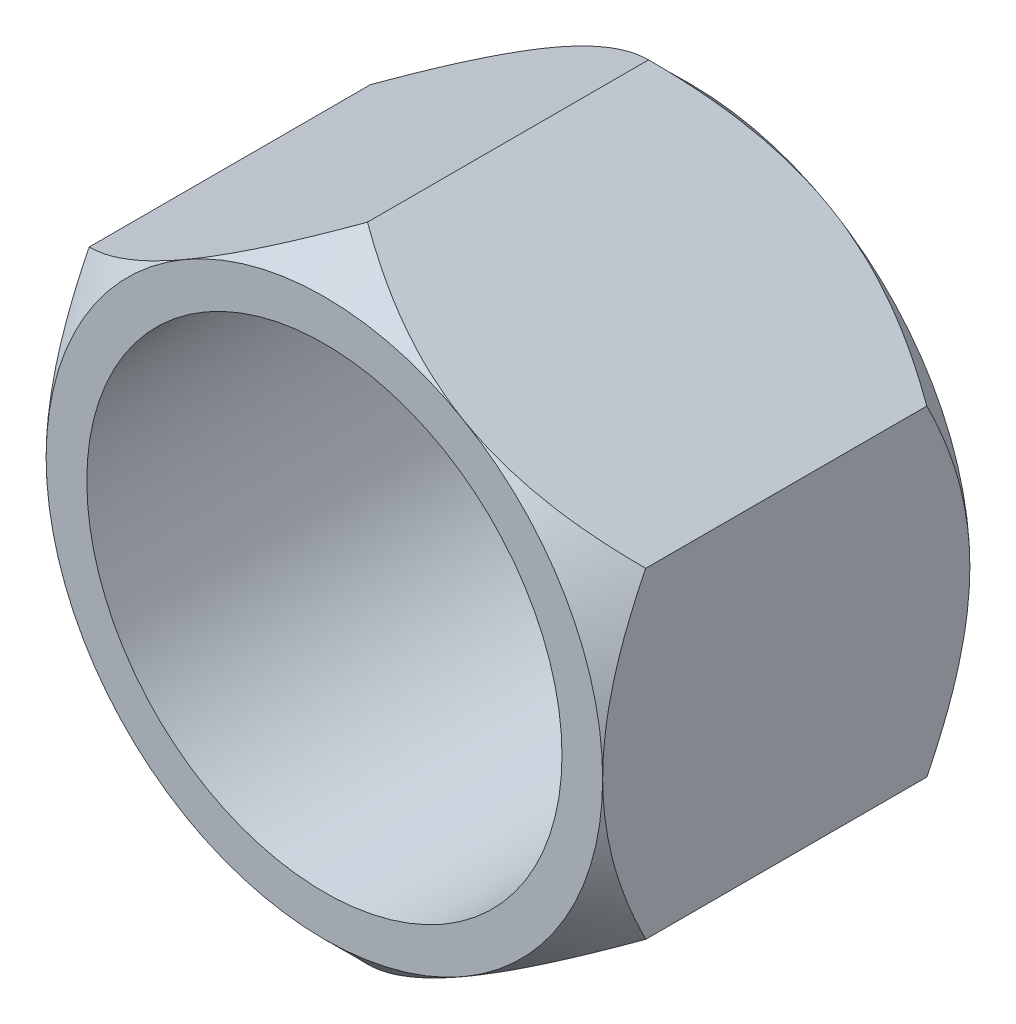
ISO-10303-21;
HEADER;
FILE_DESCRIPTION(('STEP AP214'),'2;1');
FILE_NAME('part.step','',(''),(''),'','','');
FILE_SCHEMA(('AUTOMOTIVE_DESIGN { 1 0 10303 214 1 1 1 1 }'));
ENDSEC;
DATA;
#1=APPLICATION_CONTEXT('core data for automotive mechanical design processes');
#2=APPLICATION_PROTOCOL_DEFINITION('international standard','automotive_design',2000,#1);
#3=PRODUCT_CONTEXT('',#1,'mechanical');
#4=PRODUCT('Part','Part','',(#3));
#5=PRODUCT_RELATED_PRODUCT_CATEGORY('part','',(#4));
#6=PRODUCT_DEFINITION_FORMATION('','',#4);
#7=PRODUCT_DEFINITION_CONTEXT('part definition',#1,'design');
#8=PRODUCT_DEFINITION('design','',#6,#7);
#9=PRODUCT_DEFINITION_SHAPE('','',#8);
#10=(LENGTH_UNIT() NAMED_UNIT(*) SI_UNIT(.MILLI.,.METRE.));
#11=(NAMED_UNIT(*) PLANE_ANGLE_UNIT() SI_UNIT($,.RADIAN.));
#12=(NAMED_UNIT(*) SI_UNIT($,.STERADIAN.) SOLID_ANGLE_UNIT());
#13=UNCERTAINTY_MEASURE_WITH_UNIT(LENGTH_MEASURE(1.E-05),#10,'distance_accuracy_value','');
#14=(GEOMETRIC_REPRESENTATION_CONTEXT(3) GLOBAL_UNCERTAINTY_ASSIGNED_CONTEXT((#13)) GLOBAL_UNIT_ASSIGNED_CONTEXT((#10,
#11,#12)) REPRESENTATION_CONTEXT('',''));
#15=CARTESIAN_POINT('',(0.,0.,0.));
#16=DIRECTION('',(0.,0.,1.));
#17=DIRECTION('',(1.,0.,0.));
#18=AXIS2_PLACEMENT_3D('',#15,#16,#17);
#19=CARTESIAN_POINT('',(0.151554445662277,-0.0875,0.2));
#20=DIRECTION('',(-1.,0.,0.));
#21=DIRECTION('',(0.,-1.,0.));
#22=AXIS2_PLACEMENT_3D('',#19,#20,#21);
#23=PLANE('',#22);
#24=CARTESIAN_POINT('',(0.151554445662277,0.265252809045647,0.153941548921296));
#25=CARTESIAN_POINT('',(0.151554445662277,0.257413577521273,0.147136723057462));
#26=CARTESIAN_POINT('',(0.151554445662277,0.24953890268298,0.140371685194706));
#27=CARTESIAN_POINT('',(0.151554445662277,0.233693360178287,0.126947700726018));
#28=CARTESIAN_POINT('',(0.151554445662277,0.225722448845134,0.120288805725225));
#29=CARTESIAN_POINT('',(0.151554445662277,0.20127757927172,0.100224502949948));
#30=CARTESIAN_POINT('',(0.151554445662277,0.184622038181727,0.0870403761324174));
#31=CARTESIAN_POINT('',(0.151554445662277,0.150473327964701,0.0616957198227952));
#32=CARTESIAN_POINT('',(0.151554445662277,0.132979032551724,0.0495366307855175));
#33=CARTESIAN_POINT('',(0.151554445662277,0.105718301421107,0.0330932832712818));
#34=CARTESIAN_POINT('',(0.151554445662277,0.0964952228144128,0.0279262235469108));
#35=CARTESIAN_POINT('',(0.151554445662277,0.0775984991883152,0.0185126288870026));
#36=CARTESIAN_POINT('',(0.151554445662277,0.0679257178102974,0.0142644114034934));
#37=CARTESIAN_POINT('',(0.151554445662277,0.0478316038796866,0.00708739186175746));
#38=CARTESIAN_POINT('',(0.151554445662277,0.037398452796036,0.00418982297345107));
#39=CARTESIAN_POINT('',(0.151554445662277,0.0162087911267058,0.000514071164123184));
#40=CARTESIAN_POINT('',(0.151554445662277,0.00545499835341562,-0.000278552646487929));
#41=CARTESIAN_POINT('',(0.151554445662277,-0.0159837687082633,0.000461357663632967));
#42=CARTESIAN_POINT('',(0.151554445662277,-0.0266685911855761,0.00199792918940043));
#43=CARTESIAN_POINT('',(0.151554445662277,-0.0476361544442964,0.0069767725204824));
#44=CARTESIAN_POINT('',(0.151554445662277,-0.0579151064681395,0.0104338234269583));
#45=CARTESIAN_POINT('',(0.151554445662277,-0.0801193372832188,0.0195101444980973));
#46=CARTESIAN_POINT('',(0.151554445662277,-0.0919131136327771,0.0254369229488123));
#47=CARTESIAN_POINT('',(0.151554445662277,-0.114891112264997,0.0383914997639153));
#48=CARTESIAN_POINT('',(0.151554445662277,-0.126073703401082,0.0454220673415832));
#49=CARTESIAN_POINT('',(0.151554445662277,-0.159073594711803,0.067535252787283));
#50=CARTESIAN_POINT('',(0.151554445662277,-0.180233305289954,0.0835830423921809));
#51=CARTESIAN_POINT('',(0.151554445662277,-0.211935596096085,0.108918432436797));
#52=CARTESIAN_POINT('',(0.151554445662277,-0.222792672966286,0.117837131132731));
#53=CARTESIAN_POINT('',(0.151554445662277,-0.244202905506288,0.135794388517067));
#54=CARTESIAN_POINT('',(0.151554445662277,-0.254758097971517,0.144830512966466));
#55=CARTESIAN_POINT('',(0.151554445662277,-0.265252809045661,0.153941548921278));
#56=B_SPLINE_CURVE_WITH_KNOTS('',3,(#24,#25,#26,#27,#28,#29,#30,#31,#32,#33,#34,#35,#36,#37,#38,
#39,#40,#41,#42,#43,#44,#45,#46,#47,#48,#49,#50,#51,#52,#53,#54,#55),.UNSPECIFIED.,.F.,.F.,(4,2,
2,2,2,2,2,2,2,2,2,2,2,2,2,4),(0.,0.0311431138682024,0.0623009336330362,0.126017401817194,
0.189821965989263,0.221505344129968,0.253130204278878,0.285453957410121,0.317555374899199,
0.349712500345424,0.382120590202589,0.421615362736235,0.461210852523175,0.540768899069106,
0.582922874670617,0.624608288906082),.UNSPECIFIED.);
#57=CARTESIAN_POINT('',(0.151554445662277,0.0875,0.0234455543377232));
#58=VERTEX_POINT('',#57);
#59=CARTESIAN_POINT('',(0.151554445662277,0.,0.));
#60=VERTEX_POINT('',#59);
#61=EDGE_CURVE('E129',#58,#60,#56,.T.);
#62=ORIENTED_EDGE('',*,*,#61,.F.);
#63=DIRECTION('',(0.,0.,-1.));
#64=VECTOR('',#63,1.);
#65=CARTESIAN_POINT('',(0.151554445662277,0.0875,0.2));
#66=LINE('',#65,#64);
#67=CARTESIAN_POINT('',(0.151554445662266,0.0875000000000063,0.176554445662288));
#68=VERTEX_POINT('',#67);
#69=EDGE_CURVE('E263',#68,#58,#66,.T.);
#70=ORIENTED_EDGE('',*,*,#69,.F.);
#71=CARTESIAN_POINT('',(0.151554445662277,-0.265252809045647,0.0460584510787042));
#72=CARTESIAN_POINT('',(0.151554445662277,-0.257413577521273,0.0528632769425375));
#73=CARTESIAN_POINT('',(0.151554445662277,-0.24953890268298,0.0596283148052938));
#74=CARTESIAN_POINT('',(0.151554445662277,-0.233693360178287,0.0730522992739818));
#75=CARTESIAN_POINT('',(0.151554445662277,-0.225722448845134,0.0797111942747751));
#76=CARTESIAN_POINT('',(0.151554445662277,-0.20127757927172,0.0997754970500525));
#77=CARTESIAN_POINT('',(0.151554445662277,-0.184622038181727,0.112959623867583));
#78=CARTESIAN_POINT('',(0.151554445662277,-0.150473327964701,0.138304280177205));
#79=CARTESIAN_POINT('',(0.151554445662277,-0.132979032551724,0.150463369214482));
#80=CARTESIAN_POINT('',(0.151554445662277,-0.105718301421107,0.166906716728718));
#81=CARTESIAN_POINT('',(0.151554445662277,-0.0964952228144128,0.172073776453089));
#82=CARTESIAN_POINT('',(0.151554445662277,-0.0775984991883151,0.181487371112997));
#83=CARTESIAN_POINT('',(0.151554445662277,-0.0679257178102973,0.185735588596507));
#84=CARTESIAN_POINT('',(0.151554445662277,-0.0478316038796865,0.192912608138243));
#85=CARTESIAN_POINT('',(0.151554445662277,-0.037398452796036,0.195810177026549));
#86=CARTESIAN_POINT('',(0.151554445662277,-0.0162087911267058,0.199485928835877));
#87=CARTESIAN_POINT('',(0.151554445662277,-0.00545499835341555,0.200278552646488));
#88=CARTESIAN_POINT('',(0.151554445662277,0.0159837687082634,0.199538642336367));
#89=CARTESIAN_POINT('',(0.151554445662277,0.0266685911855762,0.1980020708106));
#90=CARTESIAN_POINT('',(0.151554445662277,0.0476361544442965,0.193023227479518));
#91=CARTESIAN_POINT('',(0.151554445662277,0.0579151064681396,0.189566176573042));
#92=CARTESIAN_POINT('',(0.151554445662277,0.0801193372832189,0.180489855501903));
#93=CARTESIAN_POINT('',(0.151554445662277,0.0919131136327772,0.174563077051188));
#94=CARTESIAN_POINT('',(0.151554445662277,0.114891112264997,0.161608500236085));
#95=CARTESIAN_POINT('',(0.151554445662277,0.126073703401082,0.154577932658417));
#96=CARTESIAN_POINT('',(0.151554445662277,0.159073594711803,0.132464747212717));
#97=CARTESIAN_POINT('',(0.151554445662277,0.180233305289954,0.116416957607819));
#98=CARTESIAN_POINT('',(0.151554445662277,0.211935596096085,0.0910815675632034));
#99=CARTESIAN_POINT('',(0.151554445662277,0.222792672966286,0.082162868867269));
#100=CARTESIAN_POINT('',(0.151554445662277,0.244202905506288,0.0642056114829332));
#101=CARTESIAN_POINT('',(0.151554445662277,0.254758097971517,0.0551694870335342));
#102=CARTESIAN_POINT('',(0.151554445662277,0.265252809045661,0.0460584510787218));
#103=B_SPLINE_CURVE_WITH_KNOTS('',3,(#71,#72,#73,#74,#75,#76,#77,#78,#79,#80,#81,#82,#83,#84,
#85,#86,#87,#88,#89,#90,#91,#92,#93,#94,#95,#96,#97,#98,#99,#100,#101,#102),.UNSPECIFIED.,.F.,
.F.,(4,2,2,2,2,2,2,2,2,2,2,2,2,2,2,4),(0.,0.0311431138682025,0.0623009336330363,
0.126017401817194,0.189821965989263,0.221505344129968,0.253130204278878,0.285453957410121,
0.317555374899199,0.349712500345425,0.382120590202589,0.421615362736235,0.461210852523176,
0.540768899069106,0.582922874670617,0.624608288906082),.UNSPECIFIED.);
#104=CARTESIAN_POINT('',(0.151554445662277,0.,0.2));
#105=VERTEX_POINT('',#104);
#106=EDGE_CURVE('E237',#105,#68,#103,.T.);
#107=ORIENTED_EDGE('',*,*,#106,.F.);
#108=CARTESIAN_POINT('',(0.151554445662266,-0.0875000000000063,0.176554445662288));
#109=VERTEX_POINT('',#108);
#110=EDGE_CURVE('E243',#109,#105,#103,.T.);
#111=ORIENTED_EDGE('',*,*,#110,.F.);
#112=DIRECTION('',(0.,0.,-1.));
#113=VECTOR('',#112,1.);
#114=CARTESIAN_POINT('',(0.151554445662277,-0.0875,0.2));
#115=LINE('',#114,#113);
#116=CARTESIAN_POINT('',(0.151554445662266,-0.0875000000000063,0.0234455543377125));
#117=VERTEX_POINT('',#116);
#118=EDGE_CURVE('E158',#109,#117,#115,.T.);
#119=ORIENTED_EDGE('',*,*,#118,.T.);
#120=EDGE_CURVE('E141',#60,#117,#56,.T.);
#121=ORIENTED_EDGE('',*,*,#120,.F.);
#122=EDGE_LOOP('',(#62,#70,#107,#111,#119,#121));
#123=FACE_BOUND('',#122,.T.);
#124=ADVANCED_FACE('F40',(#123),#23,.F.);
#125=CARTESIAN_POINT('',(0.151554445662277,0.0875,0.2));
#126=DIRECTION('',(-0.5,-0.866025403784439,0.));
#127=DIRECTION('',(0.866025403784439,-0.5,0.));
#128=AXIS2_PLACEMENT_3D('',#125,#126,#127);
#129=PLANE('',#128);
#130=CARTESIAN_POINT('',(-0.000200000000000005,0.175115470053838,0.0235611386018788));
#131=CARTESIAN_POINT('',(0.00502828083226303,0.172096920707932,0.0205454605674913));
#132=CARTESIAN_POINT('',(0.0103331954560665,0.169034126821851,0.017703892484251));
#133=CARTESIAN_POINT('',(0.0211512473958995,0.162788321622281,0.0124999710559517));
#134=CARTESIAN_POINT('',(0.0266654240564631,0.159604710242946,0.0101405281503008));
#135=CARTESIAN_POINT('',(0.0432992773087416,0.150001150590082,0.00411271418553054));
#136=CARTESIAN_POINT('',(0.0547073467972155,0.143414698599977,0.00136935556920391));
#137=CARTESIAN_POINT('',(0.0744458228004743,0.132018684166103,-0.000290439436267426));
#138=CARTESIAN_POINT('',(0.082721897969232,0.127240489939587,-7.7900463952648E-05));
#139=CARTESIAN_POINT('',(0.0991049310100788,0.117781741403312,0.00208683659317294));
#140=CARTESIAN_POINT('',(0.107211616224695,0.113101344512417,0.00404164691935541));
#141=CARTESIAN_POINT('',(0.121477769161504,0.10486477727405,0.00876922041767958));
#142=CARTESIAN_POINT('',(0.127701797038441,0.101271333103857,0.0112994417439098));
#143=CARTESIAN_POINT('',(0.139904955476843,0.0942258362944823,0.0170015535756409));
#144=CARTESIAN_POINT('',(0.145884806895466,0.0907733674682263,0.0201713618790681));
#145=CARTESIAN_POINT('',(0.151754445662609,0.0873845299459704,0.023561138600544));
#146=B_SPLINE_CURVE_WITH_KNOTS('',3,(#130,#131,#132,#133,#134,#135,#136,#137,#138,#139,#140,
#141,#142,#143,#144,#145),.UNSPECIFIED.,.F.,.F.,(4,2,2,2,2,2,2,4),(0.,0.0202393059059528,
0.0405973982662274,0.080544190877716,0.109049903406936,0.137598427465521,0.160423713236435,
0.183175855698266),.UNSPECIFIED.);
#147=CARTESIAN_POINT('',(0.,0.174999999999994,0.0234455543377125));
#148=VERTEX_POINT('',#147);
#149=CARTESIAN_POINT('',(0.0757772228311384,0.13125,0.));
#150=VERTEX_POINT('',#149);
#151=EDGE_CURVE('E56',#148,#150,#146,.T.);
#152=ORIENTED_EDGE('',*,*,#151,.F.);
#153=DIRECTION('',(0.,0.,-1.));
#154=VECTOR('',#153,1.);
#155=CARTESIAN_POINT('',(0.,0.175,0.2));
#156=LINE('',#155,#154);
#157=CARTESIAN_POINT('',(0.,0.174999999999994,0.176554445662288));
#158=VERTEX_POINT('',#157);
#159=EDGE_CURVE('E260',#158,#148,#156,.T.);
#160=ORIENTED_EDGE('',*,*,#159,.F.);
#161=CARTESIAN_POINT('',(0.151754445662277,0.0873845299461621,0.176438861398121));
#162=CARTESIAN_POINT('',(0.146526164830014,0.0904030792920681,0.179454539432509));
#163=CARTESIAN_POINT('',(0.14122125020621,0.093465873178149,0.182296107515749));
#164=CARTESIAN_POINT('',(0.130403198266377,0.099711678377719,0.187500028944048));
#165=CARTESIAN_POINT('',(0.124889021605814,0.102895289757055,0.189859471849699));
#166=CARTESIAN_POINT('',(0.108255168353535,0.112498849409918,0.195887285814469));
#167=CARTESIAN_POINT('',(0.0968470988650612,0.119085301400023,0.198630644430796));
#168=CARTESIAN_POINT('',(0.0771086228618024,0.130481315833897,0.200290439436267));
#169=CARTESIAN_POINT('',(0.0688325476930447,0.135259510060413,0.200077900463953));
#170=CARTESIAN_POINT('',(0.0524495146521979,0.144718258596688,0.197913163406827));
#171=CARTESIAN_POINT('',(0.0443428294375817,0.149398655487583,0.195958353080645));
#172=CARTESIAN_POINT('',(0.0300766765007723,0.15763522272595,0.19123077958232));
#173=CARTESIAN_POINT('',(0.023852648623836,0.161228666896143,0.18870055825609));
#174=CARTESIAN_POINT('',(0.011649490185434,0.168274163705518,0.182998446424359));
#175=CARTESIAN_POINT('',(0.00566963876681107,0.171726632531774,0.179828638120932));
#176=CARTESIAN_POINT('',(-0.000200000000332061,0.17511547005403,0.176438861399456));
#177=B_SPLINE_CURVE_WITH_KNOTS('',3,(#161,#162,#163,#164,#165,#166,#167,#168,#169,#170,#171,
#172,#173,#174,#175,#176),.UNSPECIFIED.,.F.,.F.,(4,2,2,2,2,2,2,4),(0.,0.0202393059059528,
0.0405973982662274,0.080544190877716,0.109049903406936,0.137598427465522,0.160423713236435,
0.183175855698266),.UNSPECIFIED.);
#178=CARTESIAN_POINT('',(0.0757772228311384,0.13125,0.2));
#179=VERTEX_POINT('',#178);
#180=EDGE_CURVE('E222',#179,#158,#177,.T.);
#181=ORIENTED_EDGE('',*,*,#180,.F.);
#182=EDGE_CURVE('E229',#68,#179,#177,.T.);
#183=ORIENTED_EDGE('',*,*,#182,.F.);
#184=ORIENTED_EDGE('',*,*,#69,.T.);
#185=EDGE_CURVE('E135',#150,#58,#146,.T.);
#186=ORIENTED_EDGE('',*,*,#185,.F.);
#187=EDGE_LOOP('',(#152,#160,#181,#183,#184,#186));
#188=FACE_BOUND('',#187,.T.);
#189=ADVANCED_FACE('F214',(#188),#129,.F.);
#190=CARTESIAN_POINT('',(0.,0.175,0.2));
#191=DIRECTION('',(0.5,-0.866025403784439,0.));
#192=DIRECTION('',(0.866025403784439,0.5,0.));
#193=AXIS2_PLACEMENT_3D('',#190,#191,#192);
#194=PLANE('',#193);
#195=CARTESIAN_POINT('',(-0.151754445662277,0.0873845299461621,0.0235611386018788));
#196=CARTESIAN_POINT('',(-0.146526164830014,0.0904030792920681,0.0205454605674913));
#197=CARTESIAN_POINT('',(-0.14122125020621,0.093465873178149,0.0177038924842509));
#198=CARTESIAN_POINT('',(-0.130403198266377,0.099711678377719,0.0124999710559517));
#199=CARTESIAN_POINT('',(-0.124889021605814,0.102895289757055,0.0101405281503008));
#200=CARTESIAN_POINT('',(-0.108255168353535,0.112498849409918,0.00411271418553057));
#201=CARTESIAN_POINT('',(-0.0968470988650612,0.119085301400023,0.00136935556920389));
#202=CARTESIAN_POINT('',(-0.0771086228618024,0.130481315833897,-0.000290439436267445));
#203=CARTESIAN_POINT('',(-0.0688325476930447,0.135259510060413,-7.79004639526359E-05));
#204=CARTESIAN_POINT('',(-0.0524495146521979,0.144718258596688,0.00208683659317299));
#205=CARTESIAN_POINT('',(-0.0443428294375816,0.149398655487583,0.00404164691935546));
#206=CARTESIAN_POINT('',(-0.0300766765007723,0.15763522272595,0.00876922041767964));
#207=CARTESIAN_POINT('',(-0.023852648623836,0.161228666896143,0.0112994417439098));
#208=CARTESIAN_POINT('',(-0.011649490185434,0.168274163705518,0.0170015535756409));
#209=CARTESIAN_POINT('',(-0.00566963876681107,0.171726632531774,0.0201713618790681));
#210=CARTESIAN_POINT('',(0.000200000000332058,0.17511547005403,0.023561138600544));
#211=B_SPLINE_CURVE_WITH_KNOTS('',3,(#195,#196,#197,#198,#199,#200,#201,#202,#203,#204,#205,
#206,#207,#208,#209,#210),.UNSPECIFIED.,.F.,.F.,(4,2,2,2,2,2,2,4),(0.,0.0202393059059529,
0.0405973982662275,0.080544190877716,0.109049903406936,0.137598427465522,0.160423713236435,
0.183175855698266),.UNSPECIFIED.);
#212=CARTESIAN_POINT('',(-0.151554445662277,0.0875000000021118,0.0234455543375051));
#213=VERTEX_POINT('',#212);
#214=CARTESIAN_POINT('',(-0.0757772228311384,0.13125,0.));
#215=VERTEX_POINT('',#214);
#216=EDGE_CURVE('E63',#213,#215,#211,.T.);
#217=ORIENTED_EDGE('',*,*,#216,.F.);
#218=DIRECTION('',(0.,0.,-1.));
#219=VECTOR('',#218,1.);
#220=CARTESIAN_POINT('',(-0.151554445662277,0.0875,0.2));
#221=LINE('',#220,#219);
#222=CARTESIAN_POINT('',(-0.151554445662277,0.0875,0.176554445662277));
#223=VERTEX_POINT('',#222);
#224=EDGE_CURVE('E257',#223,#213,#221,.T.);
#225=ORIENTED_EDGE('',*,*,#224,.F.);
#226=CARTESIAN_POINT('',(0.000199999999999994,0.175115470053838,0.176438861398121));
#227=CARTESIAN_POINT('',(-0.00502828083226303,0.172096920707932,0.179454539432509));
#228=CARTESIAN_POINT('',(-0.0103331954560665,0.169034126821851,0.182296107515749));
#229=CARTESIAN_POINT('',(-0.0211512473958996,0.162788321622281,0.187500028944048));
#230=CARTESIAN_POINT('',(-0.0266654240564631,0.159604710242946,0.189859471849699));
#231=CARTESIAN_POINT('',(-0.0432992773087416,0.150001150590082,0.195887285814469));
#232=CARTESIAN_POINT('',(-0.0547073467972155,0.143414698599977,0.198630644430796));
#233=CARTESIAN_POINT('',(-0.0744458228004743,0.132018684166103,0.200290439436267));
#234=CARTESIAN_POINT('',(-0.082721897969232,0.127240489939587,0.200077900463953));
#235=CARTESIAN_POINT('',(-0.0991049310100788,0.117781741403312,0.197913163406827));
#236=CARTESIAN_POINT('',(-0.107211616224695,0.113101344512417,0.195958353080645));
#237=CARTESIAN_POINT('',(-0.121477769161504,0.10486477727405,0.19123077958232));
#238=CARTESIAN_POINT('',(-0.127701797038441,0.101271333103857,0.18870055825609));
#239=CARTESIAN_POINT('',(-0.139904955476843,0.0942258362944823,0.182998446424359));
#240=CARTESIAN_POINT('',(-0.145884806895466,0.0907733674682263,0.179828638120932));
#241=CARTESIAN_POINT('',(-0.151754445662609,0.0873845299459704,0.176438861399456));
#242=B_SPLINE_CURVE_WITH_KNOTS('',3,(#226,#227,#228,#229,#230,#231,#232,#233,#234,#235,#236,
#237,#238,#239,#240,#241),.UNSPECIFIED.,.F.,.F.,(4,2,2,2,2,2,2,4),(0.,0.0202393059059528,
0.0405973982662274,0.0805441908777159,0.109049903406936,0.137598427465521,0.160423713236435,
0.183175855698266),.UNSPECIFIED.);
#243=CARTESIAN_POINT('',(-0.0757772228311384,0.13125,0.2));
#244=VERTEX_POINT('',#243);
#245=EDGE_CURVE('E231',#244,#223,#242,.T.);
#246=ORIENTED_EDGE('',*,*,#245,.F.);
#247=EDGE_CURVE('E230',#158,#244,#242,.T.);
#248=ORIENTED_EDGE('',*,*,#247,.F.);
#249=ORIENTED_EDGE('',*,*,#159,.T.);
#250=EDGE_CURVE('E207',#215,#148,#211,.T.);
#251=ORIENTED_EDGE('',*,*,#250,.F.);
#252=EDGE_LOOP('',(#217,#225,#246,#248,#249,#251));
#253=FACE_BOUND('',#252,.T.);
#254=ADVANCED_FACE('F217',(#253),#194,.F.);
#255=CARTESIAN_POINT('',(-0.151554445662277,0.0875,0.2));
#256=DIRECTION('',(1.,0.,0.));
#257=DIRECTION('',(0.,1.,0.));
#258=AXIS2_PLACEMENT_3D('',#255,#256,#257);
#259=PLANE('',#258);
#260=CARTESIAN_POINT('',(-0.151554445662277,-0.265252809045647,0.153941548921296));
#261=CARTESIAN_POINT('',(-0.151554445662277,-0.257413577521273,0.147136723057462));
#262=CARTESIAN_POINT('',(-0.151554445662277,-0.24953890268298,0.140371685194706));
#263=CARTESIAN_POINT('',(-0.151554445662277,-0.233693360178286,0.126947700726018));
#264=CARTESIAN_POINT('',(-0.151554445662277,-0.225722448845134,0.120288805725225));
#265=CARTESIAN_POINT('',(-0.151554445662277,-0.20127757927172,0.100224502949947));
#266=CARTESIAN_POINT('',(-0.151554445662277,-0.184622038181727,0.0870403761324173));
#267=CARTESIAN_POINT('',(-0.151554445662277,-0.150473327964701,0.0616957198227951));
#268=CARTESIAN_POINT('',(-0.151554445662277,-0.132979032551724,0.0495366307855174));
#269=CARTESIAN_POINT('',(-0.151554445662277,-0.105718301421107,0.0330932832712817));
#270=CARTESIAN_POINT('',(-0.151554445662277,-0.0964952228144127,0.0279262235469107));
#271=CARTESIAN_POINT('',(-0.151554445662277,-0.077598499188315,0.0185126288870025));
#272=CARTESIAN_POINT('',(-0.151554445662277,-0.0679257178102972,0.0142644114034933));
#273=CARTESIAN_POINT('',(-0.151554445662277,-0.0478316038796865,0.00708739186175741));
#274=CARTESIAN_POINT('',(-0.151554445662277,-0.0373984527960359,0.00418982297345103));
#275=CARTESIAN_POINT('',(-0.151554445662277,-0.0162087911267057,0.000514071164123158));
#276=CARTESIAN_POINT('',(-0.151554445662277,-0.00545499835341551,-0.000278552646487948));
#277=CARTESIAN_POINT('',(-0.151554445662277,0.0159837687082635,0.000461357663632957));
#278=CARTESIAN_POINT('',(-0.151554445662277,0.0266685911855763,0.00199792918940043));
#279=CARTESIAN_POINT('',(-0.151554445662277,0.0476361544442965,0.00697677252048241));
#280=CARTESIAN_POINT('',(-0.151554445662277,0.0579151064681396,0.0104338234269583));
#281=CARTESIAN_POINT('',(-0.151554445662277,0.0801193372832188,0.0195101444980973));
#282=CARTESIAN_POINT('',(-0.151554445662277,0.0919131136327771,0.0254369229488123));
#283=CARTESIAN_POINT('',(-0.151554445662277,0.114891112264997,0.0383914997639153));
#284=CARTESIAN_POINT('',(-0.151554445662277,0.126073703401082,0.0454220673415832));
#285=CARTESIAN_POINT('',(-0.151554445662277,0.159073594711803,0.067535252787283));
#286=CARTESIAN_POINT('',(-0.151554445662277,0.180233305289954,0.0835830423921808));
#287=CARTESIAN_POINT('',(-0.151554445662277,0.211935596096085,0.108918432436797));
#288=CARTESIAN_POINT('',(-0.151554445662277,0.222792672966286,0.117837131132731));
#289=CARTESIAN_POINT('',(-0.151554445662277,0.244202905506288,0.135794388517067));
#290=CARTESIAN_POINT('',(-0.151554445662277,0.254758097971517,0.144830512966466));
#291=CARTESIAN_POINT('',(-0.151554445662277,0.265252809045661,0.153941548921278));
#292=B_SPLINE_CURVE_WITH_KNOTS('',3,(#260,#261,#262,#263,#264,#265,#266,#267,#268,#269,#270,
#271,#272,#273,#274,#275,#276,#277,#278,#279,#280,#281,#282,#283,#284,#285,#286,#287,#288,#289,
#290,#291),.UNSPECIFIED.,.F.,.F.,(4,2,2,2,2,2,2,2,2,2,2,2,2,2,2,4),(0.,0.0311431138682024,
0.0623009336330362,0.126017401817194,0.189821965989263,0.221505344129968,0.253130204278878,
0.285453957410121,0.317555374899199,0.349712500345424,0.382120590202589,0.421615362736235,
0.461210852523175,0.540768899069106,0.582922874670617,0.624608288906082),.UNSPECIFIED.);
#293=CARTESIAN_POINT('',(-0.151554445662266,-0.0875000000000062,0.0234455543377124));
#294=VERTEX_POINT('',#293);
#295=CARTESIAN_POINT('',(-0.151554445662277,0.,0.));
#296=VERTEX_POINT('',#295);
#297=EDGE_CURVE('E173',#294,#296,#292,.T.);
#298=ORIENTED_EDGE('',*,*,#297,.F.);
#299=DIRECTION('',(0.,0.,-1.));
#300=VECTOR('',#299,1.);
#301=CARTESIAN_POINT('',(-0.151554445662277,-0.0875,0.2));
#302=LINE('',#301,#300);
#303=CARTESIAN_POINT('',(-0.151554445662266,-0.0875000000000062,0.176554445662288));
#304=VERTEX_POINT('',#303);
#305=EDGE_CURVE('E254',#304,#294,#302,.T.);
#306=ORIENTED_EDGE('',*,*,#305,.F.);
#307=CARTESIAN_POINT('',(-0.151554445662277,0.265252809045647,0.0460584510787042));
#308=CARTESIAN_POINT('',(-0.151554445662277,0.257413577521273,0.0528632769425376));
#309=CARTESIAN_POINT('',(-0.151554445662277,0.24953890268298,0.0596283148052939));
#310=CARTESIAN_POINT('',(-0.151554445662277,0.233693360178287,0.0730522992739818));
#311=CARTESIAN_POINT('',(-0.151554445662277,0.225722448845134,0.0797111942747751));
#312=CARTESIAN_POINT('',(-0.151554445662277,0.20127757927172,0.0997754970500525));
#313=CARTESIAN_POINT('',(-0.151554445662277,0.184622038181727,0.112959623867583));
#314=CARTESIAN_POINT('',(-0.151554445662277,0.150473327964701,0.138304280177205));
#315=CARTESIAN_POINT('',(-0.151554445662277,0.132979032551724,0.150463369214482));
#316=CARTESIAN_POINT('',(-0.151554445662277,0.105718301421107,0.166906716728718));
#317=CARTESIAN_POINT('',(-0.151554445662277,0.0964952228144128,0.172073776453089));
#318=CARTESIAN_POINT('',(-0.151554445662277,0.0775984991883151,0.181487371112997));
#319=CARTESIAN_POINT('',(-0.151554445662277,0.0679257178102973,0.185735588596507));
#320=CARTESIAN_POINT('',(-0.151554445662277,0.0478316038796866,0.192912608138243));
#321=CARTESIAN_POINT('',(-0.151554445662277,0.037398452796036,0.195810177026549));
#322=CARTESIAN_POINT('',(-0.151554445662277,0.0162087911267058,0.199485928835877));
#323=CARTESIAN_POINT('',(-0.151554445662277,0.00545499835341556,0.200278552646488));
#324=CARTESIAN_POINT('',(-0.151554445662277,-0.0159837687082634,0.199538642336367));
#325=CARTESIAN_POINT('',(-0.151554445662277,-0.0266685911855762,0.1980020708106));
#326=CARTESIAN_POINT('',(-0.151554445662277,-0.0476361544442965,0.193023227479518));
#327=CARTESIAN_POINT('',(-0.151554445662277,-0.0579151064681396,0.189566176573042));
#328=CARTESIAN_POINT('',(-0.151554445662277,-0.0801193372832189,0.180489855501903));
#329=CARTESIAN_POINT('',(-0.151554445662277,-0.0919131136327772,0.174563077051188));
#330=CARTESIAN_POINT('',(-0.151554445662277,-0.114891112264997,0.161608500236085));
#331=CARTESIAN_POINT('',(-0.151554445662277,-0.126073703401082,0.154577932658417));
#332=CARTESIAN_POINT('',(-0.151554445662277,-0.159073594711803,0.132464747212717));
#333=CARTESIAN_POINT('',(-0.151554445662277,-0.180233305289954,0.116416957607819));
#334=CARTESIAN_POINT('',(-0.151554445662277,-0.211935596096085,0.0910815675632033));
#335=CARTESIAN_POINT('',(-0.151554445662277,-0.222792672966286,0.082162868867269));
#336=CARTESIAN_POINT('',(-0.151554445662277,-0.244202905506288,0.0642056114829332));
#337=CARTESIAN_POINT('',(-0.151554445662277,-0.254758097971517,0.0551694870335342));
#338=CARTESIAN_POINT('',(-0.151554445662277,-0.265252809045661,0.046058451078722));
#339=B_SPLINE_CURVE_WITH_KNOTS('',3,(#307,#308,#309,#310,#311,#312,#313,#314,#315,#316,#317,
#318,#319,#320,#321,#322,#323,#324,#325,#326,#327,#328,#329,#330,#331,#332,#333,#334,#335,#336,
#337,#338),.UNSPECIFIED.,.F.,.F.,(4,2,2,2,2,2,2,2,2,2,2,2,2,2,2,4),(0.,0.0311431138682024,
0.0623009336330362,0.126017401817194,0.189821965989263,0.221505344129968,0.253130204278878,
0.285453957410121,0.317555374899199,0.349712500345424,0.382120590202589,0.421615362736235,
0.461210852523175,0.540768899069106,0.582922874670617,0.624608288906082),.UNSPECIFIED.);
#340=CARTESIAN_POINT('',(-0.151554445662277,0.,0.2));
#341=VERTEX_POINT('',#340);
#342=EDGE_CURVE('E291',#341,#304,#339,.T.);
#343=ORIENTED_EDGE('',*,*,#342,.F.);
#344=EDGE_CURVE('E296',#223,#341,#339,.T.);
#345=ORIENTED_EDGE('',*,*,#344,.F.);
#346=ORIENTED_EDGE('',*,*,#224,.T.);
#347=EDGE_CURVE('E347',#296,#213,#292,.T.);
#348=ORIENTED_EDGE('',*,*,#347,.F.);
#349=EDGE_LOOP('',(#298,#306,#343,#345,#346,#348));
#350=FACE_BOUND('',#349,.T.);
#351=ADVANCED_FACE('F279',(#350),#259,.F.);
#352=CARTESIAN_POINT('',(-0.151554445662277,-0.0875,0.2));
#353=DIRECTION('',(0.5,0.866025403784439,0.));
#354=DIRECTION('',(-0.866025403784439,0.5,0.));
#355=AXIS2_PLACEMENT_3D('',#352,#353,#354);
#356=PLANE('',#355);
#357=CARTESIAN_POINT('',(0.000200000000000098,-0.175115470053838,0.0235611386018788));
#358=CARTESIAN_POINT('',(-0.00502828083226292,-0.172096920707932,0.0205454605674912));
#359=CARTESIAN_POINT('',(-0.0103331954560664,-0.169034126821851,0.0177038924842509));
#360=CARTESIAN_POINT('',(-0.0211512473958994,-0.162788321622281,0.0124999710559517));
#361=CARTESIAN_POINT('',(-0.026665424056463,-0.159604710242945,0.0101405281503008));
#362=CARTESIAN_POINT('',(-0.0432992773087415,-0.150001150590082,0.00411271418553053));
#363=CARTESIAN_POINT('',(-0.0547073467972154,-0.143414698599977,0.00136935556920384));
#364=CARTESIAN_POINT('',(-0.0744458228004742,-0.132018684166103,-0.000290439436267496));
#365=CARTESIAN_POINT('',(-0.0827218979692319,-0.127240489939587,-7.7900463952695E-05));
#366=CARTESIAN_POINT('',(-0.0991049310100787,-0.117781741403312,0.0020868365931729));
#367=CARTESIAN_POINT('',(-0.107211616224695,-0.113101344512417,0.00404164691935537));
#368=CARTESIAN_POINT('',(-0.121477769161504,-0.10486477727405,0.00876922041767953));
#369=CARTESIAN_POINT('',(-0.127701797038441,-0.101271333103857,0.0112994417439097));
#370=CARTESIAN_POINT('',(-0.139904955476843,-0.0942258362944822,0.0170015535756408));
#371=CARTESIAN_POINT('',(-0.145884806895466,-0.0907733674682263,0.0201713618790681));
#372=CARTESIAN_POINT('',(-0.151754445662609,-0.0873845299459703,0.023561138600544));
#373=B_SPLINE_CURVE_WITH_KNOTS('',3,(#357,#358,#359,#360,#361,#362,#363,#364,#365,#366,#367,
#368,#369,#370,#371,#372),.UNSPECIFIED.,.F.,.F.,(4,2,2,2,2,2,2,4),(0.,0.0202393059059528,
0.0405973982662274,0.080544190877716,0.109049903406936,0.137598427465521,0.160423713236435,
0.183175855698266),.UNSPECIFIED.);
#374=CARTESIAN_POINT('',(0.,-0.174999999999994,0.0234455543377124));
#375=VERTEX_POINT('',#374);
#376=CARTESIAN_POINT('',(-0.0757772228311383,-0.13125,0.));
#377=VERTEX_POINT('',#376);
#378=EDGE_CURVE('E159',#375,#377,#373,.T.);
#379=ORIENTED_EDGE('',*,*,#378,.F.);
#380=DIRECTION('',(0.,0.,-1.));
#381=VECTOR('',#380,1.);
#382=CARTESIAN_POINT('',(0.,-0.175,0.2));
#383=LINE('',#382,#381);
#384=CARTESIAN_POINT('',(0.,-0.174999999999994,0.176554445662288));
#385=VERTEX_POINT('',#384);
#386=EDGE_CURVE('E251',#385,#375,#383,.T.);
#387=ORIENTED_EDGE('',*,*,#386,.F.);
#388=CARTESIAN_POINT('',(-0.151754445662277,-0.087384529946162,0.176438861398121));
#389=CARTESIAN_POINT('',(-0.146526164830014,-0.0904030792920681,0.179454539432509));
#390=CARTESIAN_POINT('',(-0.14122125020621,-0.093465873178149,0.182296107515749));
#391=CARTESIAN_POINT('',(-0.130403198266377,-0.0997116783777189,0.187500028944048));
#392=CARTESIAN_POINT('',(-0.124889021605814,-0.102895289757054,0.189859471849699));
#393=CARTESIAN_POINT('',(-0.108255168353535,-0.112498849409918,0.19588728581447));
#394=CARTESIAN_POINT('',(-0.0968470988650612,-0.119085301400023,0.198630644430796));
#395=CARTESIAN_POINT('',(-0.0771086228618024,-0.130481315833897,0.200290439436268));
#396=CARTESIAN_POINT('',(-0.0688325476930446,-0.135259510060413,0.200077900463953));
#397=CARTESIAN_POINT('',(-0.0524495146521979,-0.144718258596688,0.197913163406827));
#398=CARTESIAN_POINT('',(-0.0443428294375816,-0.149398655487583,0.195958353080645));
#399=CARTESIAN_POINT('',(-0.0300766765007723,-0.15763522272595,0.19123077958232));
#400=CARTESIAN_POINT('',(-0.023852648623836,-0.161228666896143,0.18870055825609));
#401=CARTESIAN_POINT('',(-0.0116494901854339,-0.168274163705518,0.182998446424359));
#402=CARTESIAN_POINT('',(-0.00566963876681098,-0.171726632531774,0.179828638120932));
#403=CARTESIAN_POINT('',(0.000200000000332152,-0.17511547005403,0.176438861399456));
#404=B_SPLINE_CURVE_WITH_KNOTS('',3,(#388,#389,#390,#391,#392,#393,#394,#395,#396,#397,#398,
#399,#400,#401,#402,#403),.UNSPECIFIED.,.F.,.F.,(4,2,2,2,2,2,2,4),(0.,0.0202393059059528,
0.0405973982662275,0.0805441908777161,0.109049903406936,0.137598427465522,0.160423713236435,
0.183175855698266),.UNSPECIFIED.);
#405=CARTESIAN_POINT('',(-0.0757772228311383,-0.13125,0.2));
#406=VERTEX_POINT('',#405);
#407=EDGE_CURVE('E284',#406,#385,#404,.T.);
#408=ORIENTED_EDGE('',*,*,#407,.F.);
#409=EDGE_CURVE('E289',#304,#406,#404,.T.);
#410=ORIENTED_EDGE('',*,*,#409,.F.);
#411=ORIENTED_EDGE('',*,*,#305,.T.);
#412=EDGE_CURVE('E140',#377,#294,#373,.T.);
#413=ORIENTED_EDGE('',*,*,#412,.F.);
#414=EDGE_LOOP('',(#379,#387,#408,#410,#411,#413));
#415=FACE_BOUND('',#414,.T.);
#416=ADVANCED_FACE('F273',(#415),#356,.F.);
#417=CARTESIAN_POINT('',(0.,-0.175,0.2));
#418=DIRECTION('',(-0.5,0.866025403784439,0.));
#419=DIRECTION('',(-0.866025403784439,-0.5,0.));
#420=AXIS2_PLACEMENT_3D('',#417,#418,#419);
#421=PLANE('',#420);
#422=CARTESIAN_POINT('',(0.151754445662277,-0.0873845299461621,0.0235611386018789));
#423=CARTESIAN_POINT('',(0.146526164830014,-0.0904030792920681,0.0205454605674913));
#424=CARTESIAN_POINT('',(0.14122125020621,-0.093465873178149,0.017703892484251));
#425=CARTESIAN_POINT('',(0.130403198266377,-0.099711678377719,0.0124999710559517));
#426=CARTESIAN_POINT('',(0.124889021605814,-0.102895289757055,0.0101405281503008));
#427=CARTESIAN_POINT('',(0.108255168353535,-0.112498849409918,0.00411271418553058));
#428=CARTESIAN_POINT('',(0.0968470988650613,-0.119085301400023,0.00136935556920394));
#429=CARTESIAN_POINT('',(0.0771086228618025,-0.130481315833897,-0.0002904394362674));
#430=CARTESIAN_POINT('',(0.0688325476930448,-0.135259510060413,-7.79004639526156E-05));
#431=CARTESIAN_POINT('',(0.052449514652198,-0.144718258596688,0.00208683659317297));
#432=CARTESIAN_POINT('',(0.0443428294375818,-0.149398655487583,0.00404164691935544));
#433=CARTESIAN_POINT('',(0.0300766765007725,-0.15763522272595,0.00876922041767961));
#434=CARTESIAN_POINT('',(0.0238526486238361,-0.161228666896143,0.0112994417439098));
#435=CARTESIAN_POINT('',(0.0116494901854341,-0.168274163705518,0.0170015535756409));
#436=CARTESIAN_POINT('',(0.00566963876681118,-0.171726632531774,0.0201713618790682));
#437=CARTESIAN_POINT('',(-0.000200000000331965,-0.17511547005403,0.023561138600544));
#438=B_SPLINE_CURVE_WITH_KNOTS('',3,(#422,#423,#424,#425,#426,#427,#428,#429,#430,#431,#432,
#433,#434,#435,#436,#437),.UNSPECIFIED.,.F.,.F.,(4,2,2,2,2,2,2,4),(0.,0.0202393059059528,
0.0405973982662274,0.080544190877716,0.109049903406936,0.137598427465521,0.160423713236435,
0.183175855698266),.UNSPECIFIED.);
#439=CARTESIAN_POINT('',(0.0757772228311384,-0.13125,0.));
#440=VERTEX_POINT('',#439);
#441=EDGE_CURVE('E147',#117,#440,#438,.T.);
#442=ORIENTED_EDGE('',*,*,#441,.F.);
#443=ORIENTED_EDGE('',*,*,#118,.F.);
#444=CARTESIAN_POINT('',(-0.000199999999999897,-0.175115470053838,0.176438861398121));
#445=CARTESIAN_POINT('',(0.00502828083226312,-0.172096920707932,0.179454539432509));
#446=CARTESIAN_POINT('',(0.0103331954560666,-0.169034126821851,0.182296107515749));
#447=CARTESIAN_POINT('',(0.0211512473958996,-0.162788321622281,0.187500028944048));
#448=CARTESIAN_POINT('',(0.0266654240564632,-0.159604710242946,0.189859471849699));
#449=CARTESIAN_POINT('',(0.0432992773087417,-0.150001150590082,0.195887285814469));
#450=CARTESIAN_POINT('',(0.0547073467972155,-0.143414698599977,0.198630644430796));
#451=CARTESIAN_POINT('',(0.0744458228004743,-0.132018684166103,0.200290439436267));
#452=CARTESIAN_POINT('',(0.082721897969232,-0.127240489939587,0.200077900463953));
#453=CARTESIAN_POINT('',(0.0991049310100788,-0.117781741403312,0.197913163406827));
#454=CARTESIAN_POINT('',(0.107211616224695,-0.113101344512417,0.195958353080645));
#455=CARTESIAN_POINT('',(0.121477769161504,-0.10486477727405,0.19123077958232));
#456=CARTESIAN_POINT('',(0.127701797038441,-0.101271333103857,0.18870055825609));
#457=CARTESIAN_POINT('',(0.139904955476843,-0.0942258362944823,0.182998446424359));
#458=CARTESIAN_POINT('',(0.145884806895466,-0.0907733674682263,0.179828638120932));
#459=CARTESIAN_POINT('',(0.151754445662609,-0.0873845299459704,0.176438861399456));
#460=B_SPLINE_CURVE_WITH_KNOTS('',3,(#444,#445,#446,#447,#448,#449,#450,#451,#452,#453,#454,
#455,#456,#457,#458,#459),.UNSPECIFIED.,.F.,.F.,(4,2,2,2,2,2,2,4),(0.,0.0202393059059528,
0.0405973982662274,0.0805441908777159,0.109049903406936,0.137598427465521,0.160423713236435,
0.183175855698266),.UNSPECIFIED.);
#461=CARTESIAN_POINT('',(0.0757772228311384,-0.13125,0.2));
#462=VERTEX_POINT('',#461);
#463=EDGE_CURVE('E264',#462,#109,#460,.T.);
#464=ORIENTED_EDGE('',*,*,#463,.F.);
#465=EDGE_CURVE('E152',#385,#462,#460,.T.);
#466=ORIENTED_EDGE('',*,*,#465,.F.);
#467=ORIENTED_EDGE('',*,*,#386,.T.);
#468=EDGE_CURVE('E192',#440,#375,#438,.T.);
#469=ORIENTED_EDGE('',*,*,#468,.F.);
#470=EDGE_LOOP('',(#442,#443,#464,#466,#467,#469));
#471=FACE_BOUND('',#470,.T.);
#472=ADVANCED_FACE('F269',(#471),#421,.F.);
#473=CARTESIAN_POINT('',(0.,0.,0.));
#474=DIRECTION('',(0.,0.,1.));
#475=DIRECTION('',(1.,0.,0.));
#476=AXIS2_PLACEMENT_3D('',#473,#474,#475);
#477=PLANE('',#476);
#478=CARTESIAN_POINT('',(0.,0.,0.));
#479=DIRECTION('',(0.,0.,1.));
#480=DIRECTION('',(1.,0.,0.));
#481=AXIS2_PLACEMENT_3D('',#478,#479,#480);
#482=CIRCLE('',#481,0.129403425009331);
#483=CARTESIAN_POINT('',(0.129403425009331,0.,0.));
#484=VERTEX_POINT('',#483);
#485=EDGE_CURVE('E247',#484,#484,#482,.T.);
#486=ORIENTED_EDGE('',*,*,#485,.T.);
#487=EDGE_LOOP('',(#486));
#488=FACE_BOUND('',#487,.T.);
#489=CARTESIAN_POINT('',(0.,0.,0.));
#490=DIRECTION('',(0.,0.,1.));
#491=DIRECTION('',(1.,0.,0.));
#492=AXIS2_PLACEMENT_3D('',#489,#490,#491);
#493=CIRCLE('',#492,0.151554445662277);
#494=EDGE_CURVE('E13',#60,#150,#493,.T.);
#495=ORIENTED_EDGE('',*,*,#494,.F.);
#496=EDGE_CURVE('E44',#440,#60,#493,.T.);
#497=ORIENTED_EDGE('',*,*,#496,.F.);
#498=EDGE_CURVE('E151',#377,#440,#493,.T.);
#499=ORIENTED_EDGE('',*,*,#498,.F.);
#500=EDGE_CURVE('E348',#296,#377,#493,.T.);
#501=ORIENTED_EDGE('',*,*,#500,.F.);
#502=CARTESIAN_POINT('',(0.,0.,0.));
#503=DIRECTION('',(0.,0.,-1.));
#504=DIRECTION('',(-1.,0.,0.));
#505=AXIS2_PLACEMENT_3D('',#502,#503,#504);
#506=CIRCLE('',#505,0.151554445662277);
#507=EDGE_CURVE('E350',#296,#215,#506,.T.);
#508=ORIENTED_EDGE('',*,*,#507,.T.);
#509=EDGE_CURVE('E49',#150,#215,#493,.T.);
#510=ORIENTED_EDGE('',*,*,#509,.F.);
#511=EDGE_LOOP('',(#495,#497,#499,#501,#508,#510));
#512=FACE_BOUND('',#511,.T.);
#513=ADVANCED_FACE('F153',(#488,#512),#477,.F.);
#514=CARTESIAN_POINT('',(0.,0.,0.2));
#515=DIRECTION('',(0.,0.,1.));
#516=DIRECTION('',(1.,0.,0.));
#517=AXIS2_PLACEMENT_3D('',#514,#515,#516);
#518=PLANE('',#517);
#519=CARTESIAN_POINT('',(0.,0.,0.2));
#520=DIRECTION('',(0.,0.,1.));
#521=DIRECTION('',(1.,0.,0.));
#522=AXIS2_PLACEMENT_3D('',#519,#520,#521);
#523=CIRCLE('',#522,0.129403425009331);
#524=CARTESIAN_POINT('',(0.129403425009331,0.,0.2));
#525=VERTEX_POINT('',#524);
#526=EDGE_CURVE('E244',#525,#525,#523,.T.);
#527=ORIENTED_EDGE('',*,*,#526,.F.);
#528=EDGE_LOOP('',(#527));
#529=FACE_BOUND('',#528,.T.);
#530=CARTESIAN_POINT('',(0.,0.,0.2));
#531=DIRECTION('',(0.,0.,1.));
#532=DIRECTION('',(1.,0.,0.));
#533=AXIS2_PLACEMENT_3D('',#530,#531,#532);
#534=CIRCLE('',#533,0.151554445662277);
#535=EDGE_CURVE('E320',#462,#105,#534,.T.);
#536=ORIENTED_EDGE('',*,*,#535,.T.);
#537=EDGE_CURVE('E290',#105,#179,#534,.T.);
#538=ORIENTED_EDGE('',*,*,#537,.T.);
#539=EDGE_CURVE('E319',#179,#244,#534,.T.);
#540=ORIENTED_EDGE('',*,*,#539,.T.);
#541=EDGE_CURVE('E318',#244,#341,#534,.T.);
#542=ORIENTED_EDGE('',*,*,#541,.T.);
#543=EDGE_CURVE('E305',#341,#406,#534,.T.);
#544=ORIENTED_EDGE('',*,*,#543,.T.);
#545=EDGE_CURVE('E316',#406,#462,#534,.T.);
#546=ORIENTED_EDGE('',*,*,#545,.T.);
#547=EDGE_LOOP('',(#536,#538,#540,#542,#544,#546));
#548=FACE_BOUND('',#547,.T.);
#549=ADVANCED_FACE('F315',(#529,#548),#518,.T.);
#550=CARTESIAN_POINT('',(0.,0.,0.2));
#551=DIRECTION('',(0.,0.,-1.));
#552=DIRECTION('',(-1.,0.,0.));
#553=AXIS2_PLACEMENT_3D('',#550,#551,#552);
#554=CYLINDRICAL_SURFACE('',#553,0.129403425009331);
#555=ORIENTED_EDGE('',*,*,#526,.T.);
#556=EDGE_LOOP('',(#555));
#557=FACE_BOUND('',#556,.T.);
#558=ORIENTED_EDGE('',*,*,#485,.F.);
#559=EDGE_LOOP('',(#558));
#560=FACE_BOUND('',#559,.T.);
#561=ADVANCED_FACE('F358',(#557,#560),#554,.F.);
#562=CARTESIAN_POINT('',(0.,0.,0.2));
#563=DIRECTION('',(0.,0.,-1.));
#564=DIRECTION('',(1.,0.,0.));
#565=AXIS2_PLACEMENT_3D('',#562,#563,#564);
#566=CONICAL_SURFACE('',#565,0.151554445662277,0.78539816339745);
#567=ORIENTED_EDGE('',*,*,#110,.T.);
#568=ORIENTED_EDGE('',*,*,#535,.F.);
#569=ORIENTED_EDGE('',*,*,#463,.T.);
#570=EDGE_LOOP('',(#567,#568,#569));
#571=FACE_BOUND('',#570,.T.);
#572=ADVANCED_FACE('F187',(#571),#566,.T.);
#573=ORIENTED_EDGE('',*,*,#407,.T.);
#574=ORIENTED_EDGE('',*,*,#465,.T.);
#575=ORIENTED_EDGE('',*,*,#545,.F.);
#576=EDGE_LOOP('',(#573,#574,#575));
#577=FACE_BOUND('',#576,.T.);
#578=ADVANCED_FACE('F354',(#577),#566,.T.);
#579=ORIENTED_EDGE('',*,*,#342,.T.);
#580=ORIENTED_EDGE('',*,*,#409,.T.);
#581=ORIENTED_EDGE('',*,*,#543,.F.);
#582=EDGE_LOOP('',(#579,#580,#581));
#583=FACE_BOUND('',#582,.T.);
#584=ADVANCED_FACE('F303',(#583),#566,.T.);
#585=ORIENTED_EDGE('',*,*,#245,.T.);
#586=ORIENTED_EDGE('',*,*,#344,.T.);
#587=ORIENTED_EDGE('',*,*,#541,.F.);
#588=EDGE_LOOP('',(#585,#586,#587));
#589=FACE_BOUND('',#588,.T.);
#590=ADVANCED_FACE('F340',(#589),#566,.T.);
#591=ORIENTED_EDGE('',*,*,#180,.T.);
#592=ORIENTED_EDGE('',*,*,#247,.T.);
#593=ORIENTED_EDGE('',*,*,#539,.F.);
#594=EDGE_LOOP('',(#591,#592,#593));
#595=FACE_BOUND('',#594,.T.);
#596=ADVANCED_FACE('F327',(#595),#566,.T.);
#597=ORIENTED_EDGE('',*,*,#106,.T.);
#598=ORIENTED_EDGE('',*,*,#182,.T.);
#599=ORIENTED_EDGE('',*,*,#537,.F.);
#600=EDGE_LOOP('',(#597,#598,#599));
#601=FACE_BOUND('',#600,.T.);
#602=ADVANCED_FACE('F333',(#601),#566,.T.);
#603=CARTESIAN_POINT('',(0.,0.,0.));
#604=DIRECTION('',(0.,0.,1.));
#605=DIRECTION('',(-1.,0.,0.));
#606=AXIS2_PLACEMENT_3D('',#603,#604,#605);
#607=CONICAL_SURFACE('',#606,0.151554445662277,0.78539816339745);
#608=ORIENTED_EDGE('',*,*,#120,.T.);
#609=ORIENTED_EDGE('',*,*,#441,.T.);
#610=ORIENTED_EDGE('',*,*,#496,.T.);
#611=EDGE_LOOP('',(#608,#609,#610));
#612=FACE_BOUND('',#611,.T.);
#613=ADVANCED_FACE('F145',(#612),#607,.T.);
#614=ORIENTED_EDGE('',*,*,#378,.T.);
#615=ORIENTED_EDGE('',*,*,#498,.T.);
#616=ORIENTED_EDGE('',*,*,#468,.T.);
#617=EDGE_LOOP('',(#614,#615,#616));
#618=FACE_BOUND('',#617,.T.);
#619=ADVANCED_FACE('F186',(#618),#607,.T.);
#620=ORIENTED_EDGE('',*,*,#297,.T.);
#621=ORIENTED_EDGE('',*,*,#500,.T.);
#622=ORIENTED_EDGE('',*,*,#412,.T.);
#623=EDGE_LOOP('',(#620,#621,#622));
#624=FACE_BOUND('',#623,.T.);
#625=ADVANCED_FACE('F185',(#624),#607,.T.);
#626=ORIENTED_EDGE('',*,*,#216,.T.);
#627=ORIENTED_EDGE('',*,*,#507,.F.);
#628=ORIENTED_EDGE('',*,*,#347,.T.);
#629=EDGE_LOOP('',(#626,#627,#628));
#630=FACE_BOUND('',#629,.T.);
#631=ADVANCED_FACE('F180',(#630),#607,.T.);
#632=ORIENTED_EDGE('',*,*,#250,.T.);
#633=ORIENTED_EDGE('',*,*,#151,.T.);
#634=ORIENTED_EDGE('',*,*,#509,.T.);
#635=EDGE_LOOP('',(#632,#633,#634));
#636=FACE_BOUND('',#635,.T.);
#637=ADVANCED_FACE('F184',(#636),#607,.T.);
#638=ORIENTED_EDGE('',*,*,#185,.T.);
#639=ORIENTED_EDGE('',*,*,#61,.T.);
#640=ORIENTED_EDGE('',*,*,#494,.T.);
#641=EDGE_LOOP('',(#638,#639,#640));
#642=FACE_BOUND('',#641,.T.);
#643=ADVANCED_FACE('F131',(#642),#607,.T.);
#644=CLOSED_SHELL('',(#124,#189,#254,#351,#416,#472,#513,#549,#561,#572,#578,#584,#590,#596,
#602,#613,#619,#625,#631,#637,#643));
#645=MANIFOLD_SOLID_BREP('B2',#644);
#646=ADVANCED_BREP_SHAPE_REPRESENTATION('',(#18,#645),#14);
#647=SHAPE_DEFINITION_REPRESENTATION(#9,#646);
ENDSEC;
END-ISO-10303-21;
